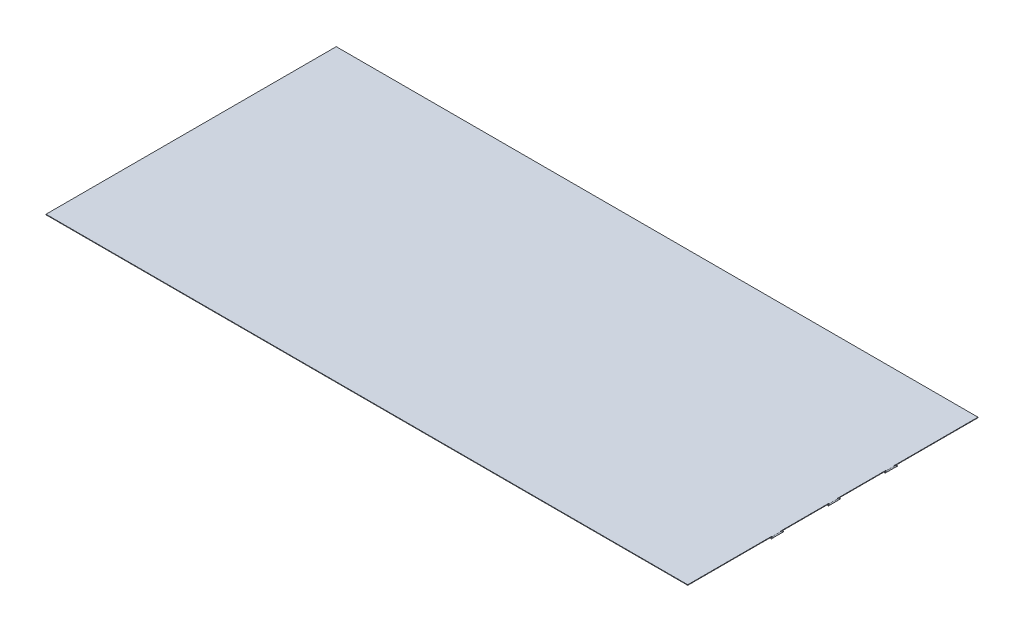
ISO-10303-21;
HEADER;
FILE_DESCRIPTION(('STEP AP214'),'2;1');
FILE_NAME('part.step','',(''),(''),'','','');
FILE_SCHEMA(('AUTOMOTIVE_DESIGN { 1 0 10303 214 1 1 1 1 }'));
ENDSEC;
DATA;
#1=APPLICATION_CONTEXT('core data for automotive mechanical design processes');
#2=APPLICATION_PROTOCOL_DEFINITION('international standard','automotive_design',2000,#1);
#3=PRODUCT_CONTEXT('',#1,'mechanical');
#4=PRODUCT('Part','Part','',(#3));
#5=PRODUCT_RELATED_PRODUCT_CATEGORY('part','',(#4));
#6=PRODUCT_DEFINITION_FORMATION('','',#4);
#7=PRODUCT_DEFINITION_CONTEXT('part definition',#1,'design');
#8=PRODUCT_DEFINITION('design','',#6,#7);
#9=PRODUCT_DEFINITION_SHAPE('','',#8);
#10=(LENGTH_UNIT() NAMED_UNIT(*) SI_UNIT(.MILLI.,.METRE.));
#11=(NAMED_UNIT(*) PLANE_ANGLE_UNIT() SI_UNIT($,.RADIAN.));
#12=(NAMED_UNIT(*) SI_UNIT($,.STERADIAN.) SOLID_ANGLE_UNIT());
#13=UNCERTAINTY_MEASURE_WITH_UNIT(LENGTH_MEASURE(1.E-05),#10,'distance_accuracy_value','');
#14=(GEOMETRIC_REPRESENTATION_CONTEXT(3) GLOBAL_UNCERTAINTY_ASSIGNED_CONTEXT((#13)) GLOBAL_UNIT_ASSIGNED_CONTEXT((#10,
#11,#12)) REPRESENTATION_CONTEXT('',''));
#15=CARTESIAN_POINT('',(0.,0.,0.));
#16=DIRECTION('',(0.,0.,1.));
#17=DIRECTION('',(1.,0.,0.));
#18=AXIS2_PLACEMENT_3D('',#15,#16,#17);
#19=CARTESIAN_POINT('',(3044.,5.,-1376.6));
#20=DIRECTION('',(-1.,0.,0.));
#21=DIRECTION('',(0.,0.,1.));
#22=AXIS2_PLACEMENT_3D('',#19,#20,#21);
#23=PLANE('',#22);
#24=DIRECTION('',(0.,1.,0.));
#25=VECTOR('',#24,1.);
#26=CARTESIAN_POINT('',(3044.,0.,500.));
#27=LINE('',#26,#25);
#28=CARTESIAN_POINT('',(3044.,0.,500.));
#29=VERTEX_POINT('',#28);
#30=CARTESIAN_POINT('',(3044.,5.,500.));
#31=VERTEX_POINT('',#30);
#32=EDGE_CURVE('E282',#29,#31,#27,.T.);
#33=ORIENTED_EDGE('',*,*,#32,.F.);
#34=DIRECTION('',(0.,0.,-1.));
#35=VECTOR('',#34,1.);
#36=CARTESIAN_POINT('',(3044.,0.,-1376.6));
#37=LINE('',#36,#35);
#38=CARTESIAN_POINT('',(3044.,0.,39.9999999999996));
#39=VERTEX_POINT('',#38);
#40=EDGE_CURVE('E346',#29,#39,#37,.T.);
#41=ORIENTED_EDGE('',*,*,#40,.T.);
#42=DIRECTION('',(0.,-1.,0.));
#43=VECTOR('',#42,1.);
#44=CARTESIAN_POINT('',(3044.,0.,40.));
#45=LINE('',#44,#43);
#46=CARTESIAN_POINT('',(3044.,5.,39.9999999999996));
#47=VERTEX_POINT('',#46);
#48=EDGE_CURVE('E306',#47,#39,#45,.T.);
#49=ORIENTED_EDGE('',*,*,#48,.F.);
#50=DIRECTION('',(0.,0.,-1.));
#51=VECTOR('',#50,1.);
#52=CARTESIAN_POINT('',(3044.,5.,-1376.6));
#53=LINE('',#52,#51);
#54=EDGE_CURVE('E330',#31,#47,#53,.T.);
#55=ORIENTED_EDGE('',*,*,#54,.F.);
#56=EDGE_LOOP('',(#33,#41,#49,#55));
#57=FACE_BOUND('',#56,.T.);
#58=ADVANCED_FACE('F43',(#57),#23,.F.);
#59=DIRECTION('',(0.,-1.,0.));
#60=VECTOR('',#59,1.);
#61=CARTESIAN_POINT('',(3044.,0.,580.));
#62=LINE('',#61,#60);
#63=CARTESIAN_POINT('',(3044.,5.,580.));
#64=VERTEX_POINT('',#63);
#65=CARTESIAN_POINT('',(3044.,0.,580.));
#66=VERTEX_POINT('',#65);
#67=EDGE_CURVE('E279',#64,#66,#62,.T.);
#68=ORIENTED_EDGE('',*,*,#67,.F.);
#69=CARTESIAN_POINT('',(3044.,5.,1376.6));
#70=VERTEX_POINT('',#69);
#71=EDGE_CURVE('E169',#70,#64,#53,.T.);
#72=ORIENTED_EDGE('',*,*,#71,.F.);
#73=DIRECTION('',(0.,-1.,0.));
#74=VECTOR('',#73,1.);
#75=CARTESIAN_POINT('',(3044.,5.,1376.6));
#76=LINE('',#75,#74);
#77=CARTESIAN_POINT('',(3044.,0.,1376.6));
#78=VERTEX_POINT('',#77);
#79=EDGE_CURVE('E340',#70,#78,#76,.T.);
#80=ORIENTED_EDGE('',*,*,#79,.T.);
#81=EDGE_CURVE('E341',#78,#66,#37,.T.);
#82=ORIENTED_EDGE('',*,*,#81,.T.);
#83=EDGE_LOOP('',(#68,#72,#80,#82));
#84=FACE_BOUND('',#83,.T.);
#85=ADVANCED_FACE('F383',(#84),#23,.F.);
#86=DIRECTION('',(0.,1.,0.));
#87=VECTOR('',#86,1.);
#88=CARTESIAN_POINT('',(3044.,0.,-580.));
#89=LINE('',#88,#87);
#90=CARTESIAN_POINT('',(3044.,0.,-580.));
#91=VERTEX_POINT('',#90);
#92=CARTESIAN_POINT('',(3044.,5.,-580.));
#93=VERTEX_POINT('',#92);
#94=EDGE_CURVE('E302',#91,#93,#89,.T.);
#95=ORIENTED_EDGE('',*,*,#94,.F.);
#96=CARTESIAN_POINT('',(3044.,0.,-1376.6));
#97=VERTEX_POINT('',#96);
#98=EDGE_CURVE('E326',#91,#97,#37,.T.);
#99=ORIENTED_EDGE('',*,*,#98,.T.);
#100=DIRECTION('',(0.,-1.,0.));
#101=VECTOR('',#100,1.);
#102=CARTESIAN_POINT('',(3044.,5.,-1376.6));
#103=LINE('',#102,#101);
#104=CARTESIAN_POINT('',(3044.,5.,-1376.6));
#105=VERTEX_POINT('',#104);
#106=EDGE_CURVE('E11',#105,#97,#103,.T.);
#107=ORIENTED_EDGE('',*,*,#106,.F.);
#108=EDGE_CURVE('E356',#93,#105,#53,.T.);
#109=ORIENTED_EDGE('',*,*,#108,.F.);
#110=EDGE_LOOP('',(#95,#99,#107,#109));
#111=FACE_BOUND('',#110,.T.);
#112=ADVANCED_FACE('F385',(#111),#23,.F.);
#113=DIRECTION('',(0.,-1.,0.));
#114=VECTOR('',#113,1.);
#115=CARTESIAN_POINT('',(3044.,0.,-500.));
#116=LINE('',#115,#114);
#117=CARTESIAN_POINT('',(3044.,5.,-500.));
#118=VERTEX_POINT('',#117);
#119=CARTESIAN_POINT('',(3044.,0.,-500.));
#120=VERTEX_POINT('',#119);
#121=EDGE_CURVE('E298',#118,#120,#116,.T.);
#122=ORIENTED_EDGE('',*,*,#121,.F.);
#123=CARTESIAN_POINT('',(3044.,5.00000000000028,-40.));
#124=VERTEX_POINT('',#123);
#125=EDGE_CURVE('E331',#124,#118,#53,.T.);
#126=ORIENTED_EDGE('',*,*,#125,.F.);
#127=DIRECTION('',(0.,1.,0.));
#128=VECTOR('',#127,1.);
#129=CARTESIAN_POINT('',(3044.,0.,-40.));
#130=LINE('',#129,#128);
#131=CARTESIAN_POINT('',(3044.,0.,-40.0000000000005));
#132=VERTEX_POINT('',#131);
#133=EDGE_CURVE('E310',#132,#124,#130,.T.);
#134=ORIENTED_EDGE('',*,*,#133,.F.);
#135=EDGE_CURVE('E347',#132,#120,#37,.T.);
#136=ORIENTED_EDGE('',*,*,#135,.T.);
#137=EDGE_LOOP('',(#122,#126,#134,#136));
#138=FACE_BOUND('',#137,.T.);
#139=ADVANCED_FACE('F390',(#138),#23,.F.);
#140=CARTESIAN_POINT('',(-3044.,5.,-1376.6));
#141=DIRECTION('',(0.,0.,1.));
#142=DIRECTION('',(1.,0.,0.));
#143=AXIS2_PLACEMENT_3D('',#140,#141,#142);
#144=PLANE('',#143);
#145=DIRECTION('',(-1.,0.,0.));
#146=VECTOR('',#145,1.);
#147=CARTESIAN_POINT('',(-3044.,0.,-1376.6));
#148=LINE('',#147,#146);
#149=CARTESIAN_POINT('',(-3044.,0.,-1376.6));
#150=VERTEX_POINT('',#149);
#151=EDGE_CURVE('E345',#97,#150,#148,.T.);
#152=ORIENTED_EDGE('',*,*,#151,.T.);
#153=DIRECTION('',(0.,-1.,0.));
#154=VECTOR('',#153,1.);
#155=CARTESIAN_POINT('',(-3044.,5.,-1376.6));
#156=LINE('',#155,#154);
#157=CARTESIAN_POINT('',(-3044.,5.,-1376.6));
#158=VERTEX_POINT('',#157);
#159=EDGE_CURVE('E51',#158,#150,#156,.T.);
#160=ORIENTED_EDGE('',*,*,#159,.F.);
#161=DIRECTION('',(-1.,0.,0.));
#162=VECTOR('',#161,1.);
#163=CARTESIAN_POINT('',(-3044.,5.,-1376.6));
#164=LINE('',#163,#162);
#165=EDGE_CURVE('E329',#105,#158,#164,.T.);
#166=ORIENTED_EDGE('',*,*,#165,.F.);
#167=ORIENTED_EDGE('',*,*,#106,.T.);
#168=EDGE_LOOP('',(#152,#160,#166,#167));
#169=FACE_BOUND('',#168,.T.);
#170=ADVANCED_FACE('F397',(#169),#144,.F.);
#171=CARTESIAN_POINT('',(-3044.,5.,-1376.6));
#172=DIRECTION('',(1.,0.,0.));
#173=DIRECTION('',(0.,0.,-1.));
#174=AXIS2_PLACEMENT_3D('',#171,#172,#173);
#175=PLANE('',#174);
#176=DIRECTION('',(0.,0.,1.));
#177=VECTOR('',#176,1.);
#178=CARTESIAN_POINT('',(-3044.,0.,-1376.6));
#179=LINE('',#178,#177);
#180=CARTESIAN_POINT('',(-3044.,0.,1376.6));
#181=VERTEX_POINT('',#180);
#182=EDGE_CURVE('E350',#150,#181,#179,.T.);
#183=ORIENTED_EDGE('',*,*,#182,.T.);
#184=DIRECTION('',(0.,-1.,0.));
#185=VECTOR('',#184,1.);
#186=CARTESIAN_POINT('',(-3044.,5.,1376.6));
#187=LINE('',#186,#185);
#188=CARTESIAN_POINT('',(-3044.,5.,1376.6));
#189=VERTEX_POINT('',#188);
#190=EDGE_CURVE('E360',#189,#181,#187,.T.);
#191=ORIENTED_EDGE('',*,*,#190,.F.);
#192=DIRECTION('',(0.,0.,1.));
#193=VECTOR('',#192,1.);
#194=CARTESIAN_POINT('',(-3044.,5.,-1376.6));
#195=LINE('',#194,#193);
#196=EDGE_CURVE('E334',#158,#189,#195,.T.);
#197=ORIENTED_EDGE('',*,*,#196,.F.);
#198=ORIENTED_EDGE('',*,*,#159,.T.);
#199=EDGE_LOOP('',(#183,#191,#197,#198));
#200=FACE_BOUND('',#199,.T.);
#201=ADVANCED_FACE('F369',(#200),#175,.F.);
#202=CARTESIAN_POINT('',(-3044.,5.,1376.6));
#203=DIRECTION('',(0.,0.,-1.));
#204=DIRECTION('',(-1.,0.,0.));
#205=AXIS2_PLACEMENT_3D('',#202,#203,#204);
#206=PLANE('',#205);
#207=DIRECTION('',(1.,0.,0.));
#208=VECTOR('',#207,1.);
#209=CARTESIAN_POINT('',(-3044.,0.,1376.6));
#210=LINE('',#209,#208);
#211=EDGE_CURVE('E353',#181,#78,#210,.T.);
#212=ORIENTED_EDGE('',*,*,#211,.T.);
#213=ORIENTED_EDGE('',*,*,#79,.F.);
#214=DIRECTION('',(1.,0.,0.));
#215=VECTOR('',#214,1.);
#216=CARTESIAN_POINT('',(-3044.,5.,1376.6));
#217=LINE('',#216,#215);
#218=EDGE_CURVE('E337',#189,#70,#217,.T.);
#219=ORIENTED_EDGE('',*,*,#218,.F.);
#220=ORIENTED_EDGE('',*,*,#190,.T.);
#221=EDGE_LOOP('',(#212,#213,#219,#220));
#222=FACE_BOUND('',#221,.T.);
#223=ADVANCED_FACE('F380',(#222),#206,.F.);
#224=CARTESIAN_POINT('',(0.,5.,0.));
#225=DIRECTION('',(0.,1.,0.));
#226=DIRECTION('',(0.,0.,1.));
#227=AXIS2_PLACEMENT_3D('',#224,#225,#226);
#228=PLANE('',#227);
#229=DIRECTION('',(0.,0.,1.));
#230=VECTOR('',#229,1.);
#231=CARTESIAN_POINT('',(3049.66987298108,5.,500.));
#232=LINE('',#231,#230);
#233=CARTESIAN_POINT('',(3049.66987298108,5.,500.));
#234=VERTEX_POINT('',#233);
#235=CARTESIAN_POINT('',(3049.66987298108,5.,580.));
#236=VERTEX_POINT('',#235);
#237=EDGE_CURVE('E154',#234,#236,#232,.T.);
#238=ORIENTED_EDGE('',*,*,#237,.F.);
#239=DIRECTION('',(-1.,0.,0.));
#240=VECTOR('',#239,1.);
#241=CARTESIAN_POINT('',(3054.,5.,500.));
#242=LINE('',#241,#240);
#243=EDGE_CURVE('E175',#234,#31,#242,.T.);
#244=ORIENTED_EDGE('',*,*,#243,.T.);
#245=ORIENTED_EDGE('',*,*,#54,.T.);
#246=DIRECTION('',(-1.,0.,0.));
#247=VECTOR('',#246,1.);
#248=CARTESIAN_POINT('',(3054.,5.00000000000025,40.));
#249=LINE('',#248,#247);
#250=CARTESIAN_POINT('',(3049.66987298108,5.0000000000001,40.));
#251=VERTEX_POINT('',#250);
#252=EDGE_CURVE('E314',#251,#47,#249,.T.);
#253=ORIENTED_EDGE('',*,*,#252,.F.);
#254=DIRECTION('',(0.,0.,1.));
#255=VECTOR('',#254,1.);
#256=CARTESIAN_POINT('',(3049.66987298108,5.,-40.));
#257=LINE('',#256,#255);
#258=CARTESIAN_POINT('',(3049.66987298108,5.00000000000028,-40.));
#259=VERTEX_POINT('',#258);
#260=EDGE_CURVE('E269',#259,#251,#257,.T.);
#261=ORIENTED_EDGE('',*,*,#260,.F.);
#262=DIRECTION('',(-1.,0.,0.));
#263=VECTOR('',#262,1.);
#264=CARTESIAN_POINT('',(3054.,5.00000000000028,-40.));
#265=LINE('',#264,#263);
#266=EDGE_CURVE('E317',#259,#124,#265,.T.);
#267=ORIENTED_EDGE('',*,*,#266,.T.);
#268=ORIENTED_EDGE('',*,*,#125,.T.);
#269=DIRECTION('',(-1.,0.,0.));
#270=VECTOR('',#269,1.);
#271=CARTESIAN_POINT('',(3054.,5.,-500.));
#272=LINE('',#271,#270);
#273=CARTESIAN_POINT('',(3049.66987298108,4.99999999999981,-500.));
#274=VERTEX_POINT('',#273);
#275=EDGE_CURVE('E292',#274,#118,#272,.T.);
#276=ORIENTED_EDGE('',*,*,#275,.F.);
#277=DIRECTION('',(0.,0.,1.));
#278=VECTOR('',#277,1.);
#279=CARTESIAN_POINT('',(3049.66987298108,5.,-580.));
#280=LINE('',#279,#278);
#281=CARTESIAN_POINT('',(3049.66987298108,5.,-580.));
#282=VERTEX_POINT('',#281);
#283=EDGE_CURVE('E232',#282,#274,#280,.T.);
#284=ORIENTED_EDGE('',*,*,#283,.F.);
#285=DIRECTION('',(-1.,0.,0.));
#286=VECTOR('',#285,1.);
#287=CARTESIAN_POINT('',(3054.,5.,-580.));
#288=LINE('',#287,#286);
#289=EDGE_CURVE('E289',#282,#93,#288,.T.);
#290=ORIENTED_EDGE('',*,*,#289,.T.);
#291=ORIENTED_EDGE('',*,*,#108,.T.);
#292=ORIENTED_EDGE('',*,*,#165,.T.);
#293=ORIENTED_EDGE('',*,*,#196,.T.);
#294=ORIENTED_EDGE('',*,*,#218,.T.);
#295=ORIENTED_EDGE('',*,*,#71,.T.);
#296=DIRECTION('',(-1.,0.,0.));
#297=VECTOR('',#296,1.);
#298=CARTESIAN_POINT('',(3054.,5.,580.));
#299=LINE('',#298,#297);
#300=EDGE_CURVE('E166',#236,#64,#299,.T.);
#301=ORIENTED_EDGE('',*,*,#300,.F.);
#302=EDGE_LOOP('',(#238,#244,#245,#253,#261,#267,#268,#276,#284,#290,#291,#292,#293,#294,#295,#301));
#303=FACE_BOUND('',#302,.T.);
#304=ADVANCED_FACE('F167',(#303),#228,.T.);
#305=CARTESIAN_POINT('',(0.,0.,0.));
#306=DIRECTION('',(0.,1.,0.));
#307=DIRECTION('',(0.,0.,1.));
#308=AXIS2_PLACEMENT_3D('',#305,#306,#307);
#309=PLANE('',#308);
#310=DIRECTION('',(-1.,0.,0.));
#311=VECTOR('',#310,1.);
#312=CARTESIAN_POINT('',(3054.,0.,500.));
#313=LINE('',#312,#311);
#314=CARTESIAN_POINT('',(3049.66987298108,0.,500.));
#315=VERTEX_POINT('',#314);
#316=EDGE_CURVE('E276',#315,#29,#313,.T.);
#317=ORIENTED_EDGE('',*,*,#316,.F.);
#318=DIRECTION('',(0.,0.,1.));
#319=VECTOR('',#318,1.);
#320=CARTESIAN_POINT('',(3049.66987298108,0.,500.));
#321=LINE('',#320,#319);
#322=CARTESIAN_POINT('',(3049.66987298108,0.,580.));
#323=VERTEX_POINT('',#322);
#324=EDGE_CURVE('E65',#315,#323,#321,.T.);
#325=ORIENTED_EDGE('',*,*,#324,.T.);
#326=DIRECTION('',(-1.,0.,0.));
#327=VECTOR('',#326,1.);
#328=CARTESIAN_POINT('',(3054.,0.,580.));
#329=LINE('',#328,#327);
#330=EDGE_CURVE('E174',#323,#66,#329,.T.);
#331=ORIENTED_EDGE('',*,*,#330,.T.);
#332=ORIENTED_EDGE('',*,*,#81,.F.);
#333=ORIENTED_EDGE('',*,*,#211,.F.);
#334=ORIENTED_EDGE('',*,*,#182,.F.);
#335=ORIENTED_EDGE('',*,*,#151,.F.);
#336=ORIENTED_EDGE('',*,*,#98,.F.);
#337=DIRECTION('',(-1.,0.,0.));
#338=VECTOR('',#337,1.);
#339=CARTESIAN_POINT('',(3054.,0.,-580.));
#340=LINE('',#339,#338);
#341=CARTESIAN_POINT('',(3049.66987298108,-2.15973072759112E-13,-580.));
#342=VERTEX_POINT('',#341);
#343=EDGE_CURVE('E286',#342,#91,#340,.T.);
#344=ORIENTED_EDGE('',*,*,#343,.F.);
#345=DIRECTION('',(0.,0.,1.));
#346=VECTOR('',#345,1.);
#347=CARTESIAN_POINT('',(3049.66987298108,0.,-580.));
#348=LINE('',#347,#346);
#349=CARTESIAN_POINT('',(3049.66987298108,0.,-500.));
#350=VERTEX_POINT('',#349);
#351=EDGE_CURVE('E229',#342,#350,#348,.T.);
#352=ORIENTED_EDGE('',*,*,#351,.T.);
#353=DIRECTION('',(-1.,0.,0.));
#354=VECTOR('',#353,1.);
#355=CARTESIAN_POINT('',(3054.,0.,-500.));
#356=LINE('',#355,#354);
#357=EDGE_CURVE('E295',#350,#120,#356,.T.);
#358=ORIENTED_EDGE('',*,*,#357,.T.);
#359=ORIENTED_EDGE('',*,*,#135,.F.);
#360=DIRECTION('',(-1.,0.,0.));
#361=VECTOR('',#360,1.);
#362=CARTESIAN_POINT('',(3054.,0.,-40.));
#363=LINE('',#362,#361);
#364=CARTESIAN_POINT('',(3049.66987298108,0.,-40.));
#365=VERTEX_POINT('',#364);
#366=EDGE_CURVE('E320',#365,#132,#363,.T.);
#367=ORIENTED_EDGE('',*,*,#366,.F.);
#368=DIRECTION('',(0.,0.,1.));
#369=VECTOR('',#368,1.);
#370=CARTESIAN_POINT('',(3049.66987298108,0.,-40.));
#371=LINE('',#370,#369);
#372=CARTESIAN_POINT('',(3049.66987298108,0.,40.));
#373=VERTEX_POINT('',#372);
#374=EDGE_CURVE('E263',#365,#373,#371,.T.);
#375=ORIENTED_EDGE('',*,*,#374,.T.);
#376=DIRECTION('',(-1.,0.,0.));
#377=VECTOR('',#376,1.);
#378=CARTESIAN_POINT('',(3054.,0.,40.));
#379=LINE('',#378,#377);
#380=EDGE_CURVE('E323',#373,#39,#379,.T.);
#381=ORIENTED_EDGE('',*,*,#380,.T.);
#382=ORIENTED_EDGE('',*,*,#40,.F.);
#383=EDGE_LOOP('',(#317,#325,#331,#332,#333,#334,#335,#336,#344,#352,#358,#359,#367,#375,#381,#382));
#384=FACE_BOUND('',#383,.T.);
#385=ADVANCED_FACE('F375',(#384),#309,.F.);
#386=CARTESIAN_POINT('',(3054.,0.,40.));
#387=DIRECTION('',(0.,0.,-1.));
#388=DIRECTION('',(-1.,0.,0.));
#389=AXIS2_PLACEMENT_3D('',#386,#387,#388);
#390=PLANE('',#389);
#391=CARTESIAN_POINT('',(3054.,2.5,40.));
#392=DIRECTION('',(0.,0.,1.));
#393=DIRECTION('',(1.,0.,0.));
#394=AXIS2_PLACEMENT_3D('',#391,#392,#393);
#395=CIRCLE('',#394,4.99999999999982);
#396=EDGE_CURVE('E255',#251,#373,#395,.T.);
#397=ORIENTED_EDGE('',*,*,#396,.F.);
#398=ORIENTED_EDGE('',*,*,#252,.T.);
#399=ORIENTED_EDGE('',*,*,#48,.T.);
#400=ORIENTED_EDGE('',*,*,#380,.F.);
#401=EDGE_LOOP('',(#397,#398,#399,#400));
#402=FACE_BOUND('',#401,.T.);
#403=ADVANCED_FACE('F434',(#402),#390,.F.);
#404=CARTESIAN_POINT('',(3054.,0.,-40.));
#405=DIRECTION('',(0.,0.,1.));
#406=DIRECTION('',(1.,0.,0.));
#407=AXIS2_PLACEMENT_3D('',#404,#405,#406);
#408=PLANE('',#407);
#409=ORIENTED_EDGE('',*,*,#266,.F.);
#410=CARTESIAN_POINT('',(3054.,2.5,-40.));
#411=DIRECTION('',(0.,0.,1.));
#412=DIRECTION('',(1.,0.,0.));
#413=AXIS2_PLACEMENT_3D('',#410,#411,#412);
#414=CIRCLE('',#413,4.99999999999982);
#415=EDGE_CURVE('E247',#259,#365,#414,.T.);
#416=ORIENTED_EDGE('',*,*,#415,.T.);
#417=ORIENTED_EDGE('',*,*,#366,.T.);
#418=ORIENTED_EDGE('',*,*,#133,.T.);
#419=EDGE_LOOP('',(#409,#416,#417,#418));
#420=FACE_BOUND('',#419,.T.);
#421=ADVANCED_FACE('F453',(#420),#408,.F.);
#422=CARTESIAN_POINT('',(3054.,0.,-580.));
#423=DIRECTION('',(0.,0.,1.));
#424=DIRECTION('',(1.,0.,0.));
#425=AXIS2_PLACEMENT_3D('',#422,#423,#424);
#426=PLANE('',#425);
#427=ORIENTED_EDGE('',*,*,#289,.F.);
#428=CARTESIAN_POINT('',(3054.,2.49999999999968,-580.));
#429=DIRECTION('',(0.,0.,1.));
#430=DIRECTION('',(1.,0.,0.));
#431=AXIS2_PLACEMENT_3D('',#428,#429,#430);
#432=CIRCLE('',#431,4.99999999999982);
#433=EDGE_CURVE('E226',#282,#342,#432,.T.);
#434=ORIENTED_EDGE('',*,*,#433,.T.);
#435=ORIENTED_EDGE('',*,*,#343,.T.);
#436=ORIENTED_EDGE('',*,*,#94,.T.);
#437=EDGE_LOOP('',(#427,#434,#435,#436));
#438=FACE_BOUND('',#437,.T.);
#439=ADVANCED_FACE('F447',(#438),#426,.F.);
#440=CARTESIAN_POINT('',(3054.,0.,-500.));
#441=DIRECTION('',(0.,0.,-1.));
#442=DIRECTION('',(-1.,0.,0.));
#443=AXIS2_PLACEMENT_3D('',#440,#441,#442);
#444=PLANE('',#443);
#445=CARTESIAN_POINT('',(3054.,2.49999999999968,-500.));
#446=DIRECTION('',(0.,0.,1.));
#447=DIRECTION('',(1.,0.,0.));
#448=AXIS2_PLACEMENT_3D('',#445,#446,#447);
#449=CIRCLE('',#448,4.99999999999982);
#450=EDGE_CURVE('E163',#274,#350,#449,.T.);
#451=ORIENTED_EDGE('',*,*,#450,.F.);
#452=ORIENTED_EDGE('',*,*,#275,.T.);
#453=ORIENTED_EDGE('',*,*,#121,.T.);
#454=ORIENTED_EDGE('',*,*,#357,.F.);
#455=EDGE_LOOP('',(#451,#452,#453,#454));
#456=FACE_BOUND('',#455,.T.);
#457=ADVANCED_FACE('F439',(#456),#444,.F.);
#458=CARTESIAN_POINT('',(3054.,0.,500.));
#459=DIRECTION('',(0.,0.,1.));
#460=DIRECTION('',(1.,0.,0.));
#461=AXIS2_PLACEMENT_3D('',#458,#459,#460);
#462=PLANE('',#461);
#463=ORIENTED_EDGE('',*,*,#243,.F.);
#464=CARTESIAN_POINT('',(3054.,2.5,500.));
#465=DIRECTION('',(0.,0.,1.));
#466=DIRECTION('',(1.,0.,0.));
#467=AXIS2_PLACEMENT_3D('',#464,#465,#466);
#468=CIRCLE('',#467,4.99999999999982);
#469=EDGE_CURVE('E58',#234,#315,#468,.T.);
#470=ORIENTED_EDGE('',*,*,#469,.T.);
#471=ORIENTED_EDGE('',*,*,#316,.T.);
#472=ORIENTED_EDGE('',*,*,#32,.T.);
#473=EDGE_LOOP('',(#463,#470,#471,#472));
#474=FACE_BOUND('',#473,.T.);
#475=ADVANCED_FACE('F437',(#474),#462,.F.);
#476=CARTESIAN_POINT('',(3054.,0.,580.));
#477=DIRECTION('',(0.,0.,-1.));
#478=DIRECTION('',(-1.,0.,0.));
#479=AXIS2_PLACEMENT_3D('',#476,#477,#478);
#480=PLANE('',#479);
#481=CARTESIAN_POINT('',(3054.,2.5,580.));
#482=DIRECTION('',(0.,0.,1.));
#483=DIRECTION('',(1.,0.,0.));
#484=AXIS2_PLACEMENT_3D('',#481,#482,#483);
#485=CIRCLE('',#484,4.99999999999982);
#486=EDGE_CURVE('E159',#236,#323,#485,.T.);
#487=ORIENTED_EDGE('',*,*,#486,.F.);
#488=ORIENTED_EDGE('',*,*,#300,.T.);
#489=ORIENTED_EDGE('',*,*,#67,.T.);
#490=ORIENTED_EDGE('',*,*,#330,.F.);
#491=EDGE_LOOP('',(#487,#488,#489,#490));
#492=FACE_BOUND('',#491,.T.);
#493=ADVANCED_FACE('F177',(#492),#480,.F.);
#494=CARTESIAN_POINT('',(3054.,2.5,-40.));
#495=DIRECTION('',(0.,0.,1.));
#496=DIRECTION('',(1.,0.,0.));
#497=AXIS2_PLACEMENT_3D('',#494,#495,#496);
#498=CYLINDRICAL_SURFACE('',#497,4.99999999999982);
#499=ORIENTED_EDGE('',*,*,#415,.F.);
#500=ORIENTED_EDGE('',*,*,#260,.T.);
#501=ORIENTED_EDGE('',*,*,#396,.T.);
#502=ORIENTED_EDGE('',*,*,#374,.F.);
#503=EDGE_LOOP('',(#499,#500,#501,#502));
#504=FACE_BOUND('',#503,.T.);
#505=CARTESIAN_POINT('',(3054.,2.5,-50.));
#506=DIRECTION('',(0.,0.,1.));
#507=DIRECTION('',(1.,0.,0.));
#508=AXIS2_PLACEMENT_3D('',#505,#506,#507);
#509=CIRCLE('',#508,4.99999999999982);
#510=CARTESIAN_POINT('',(3059.,2.5,-50.));
#511=VERTEX_POINT('',#510);
#512=EDGE_CURVE('E240',#511,#511,#509,.T.);
#513=ORIENTED_EDGE('',*,*,#512,.T.);
#514=EDGE_LOOP('',(#513));
#515=FACE_BOUND('',#514,.T.);
#516=CARTESIAN_POINT('',(3054.,2.5,50.));
#517=DIRECTION('',(0.,0.,1.));
#518=DIRECTION('',(1.,0.,0.));
#519=AXIS2_PLACEMENT_3D('',#516,#517,#518);
#520=CIRCLE('',#519,4.99999999999982);
#521=CARTESIAN_POINT('',(3059.,2.5,50.));
#522=VERTEX_POINT('',#521);
#523=EDGE_CURVE('E259',#522,#522,#520,.T.);
#524=ORIENTED_EDGE('',*,*,#523,.F.);
#525=EDGE_LOOP('',(#524));
#526=FACE_BOUND('',#525,.T.);
#527=ADVANCED_FACE('F445',(#504,#515,#526),#498,.T.);
#528=CARTESIAN_POINT('',(3054.,2.5,55.));
#529=DIRECTION('',(0.,0.,-1.));
#530=DIRECTION('',(-1.,0.,0.));
#531=AXIS2_PLACEMENT_3D('',#528,#529,#530);
#532=CYLINDRICAL_SURFACE('',#531,5.99999999999986);
#533=CARTESIAN_POINT('',(3054.,2.5,55.));
#534=DIRECTION('',(0.,0.,1.));
#535=DIRECTION('',(1.,0.,0.));
#536=AXIS2_PLACEMENT_3D('',#533,#534,#535);
#537=CIRCLE('',#536,5.99999999999986);
#538=CARTESIAN_POINT('',(3060.,2.5,55.));
#539=VERTEX_POINT('',#538);
#540=EDGE_CURVE('E251',#539,#539,#537,.T.);
#541=ORIENTED_EDGE('',*,*,#540,.F.);
#542=EDGE_LOOP('',(#541));
#543=FACE_BOUND('',#542,.T.);
#544=CARTESIAN_POINT('',(3054.,2.5,50.));
#545=DIRECTION('',(0.,0.,1.));
#546=DIRECTION('',(1.,0.,0.));
#547=AXIS2_PLACEMENT_3D('',#544,#545,#546);
#548=CIRCLE('',#547,5.99999999999986);
#549=CARTESIAN_POINT('',(3060.,2.5,50.));
#550=VERTEX_POINT('',#549);
#551=EDGE_CURVE('E250',#550,#550,#548,.T.);
#552=ORIENTED_EDGE('',*,*,#551,.T.);
#553=EDGE_LOOP('',(#552));
#554=FACE_BOUND('',#553,.T.);
#555=ADVANCED_FACE('F729',(#543,#554),#532,.T.);
#556=CARTESIAN_POINT('',(3054.,2.5,55.));
#557=DIRECTION('',(0.,0.,1.));
#558=DIRECTION('',(1.,0.,0.));
#559=AXIS2_PLACEMENT_3D('',#556,#557,#558);
#560=PLANE('',#559);
#561=ORIENTED_EDGE('',*,*,#540,.T.);
#562=EDGE_LOOP('',(#561));
#563=FACE_BOUND('',#562,.T.);
#564=ADVANCED_FACE('F720',(#563),#560,.T.);
#565=CARTESIAN_POINT('',(3054.,2.5,50.));
#566=DIRECTION('',(0.,0.,1.));
#567=DIRECTION('',(1.,0.,0.));
#568=AXIS2_PLACEMENT_3D('',#565,#566,#567);
#569=PLANE('',#568);
#570=ORIENTED_EDGE('',*,*,#523,.T.);
#571=EDGE_LOOP('',(#570));
#572=FACE_BOUND('',#571,.T.);
#573=ORIENTED_EDGE('',*,*,#551,.F.);
#574=EDGE_LOOP('',(#573));
#575=FACE_BOUND('',#574,.T.);
#576=ADVANCED_FACE('F710',(#572,#575),#569,.F.);
#577=CARTESIAN_POINT('',(3054.,2.5,-55.));
#578=DIRECTION('',(0.,0.,1.));
#579=DIRECTION('',(1.,0.,0.));
#580=AXIS2_PLACEMENT_3D('',#577,#578,#579);
#581=CYLINDRICAL_SURFACE('',#580,5.99999999999986);
#582=CARTESIAN_POINT('',(3054.,2.5,-55.));
#583=DIRECTION('',(0.,0.,1.));
#584=DIRECTION('',(1.,0.,0.));
#585=AXIS2_PLACEMENT_3D('',#582,#583,#584);
#586=CIRCLE('',#585,5.99999999999986);
#587=CARTESIAN_POINT('',(3060.,2.5,-55.));
#588=VERTEX_POINT('',#587);
#589=EDGE_CURVE('E236',#588,#588,#586,.T.);
#590=ORIENTED_EDGE('',*,*,#589,.T.);
#591=EDGE_LOOP('',(#590));
#592=FACE_BOUND('',#591,.T.);
#593=CARTESIAN_POINT('',(3054.,2.5,-50.));
#594=DIRECTION('',(0.,0.,1.));
#595=DIRECTION('',(1.,0.,0.));
#596=AXIS2_PLACEMENT_3D('',#593,#594,#595);
#597=CIRCLE('',#596,5.99999999999986);
#598=CARTESIAN_POINT('',(3060.,2.5,-50.));
#599=VERTEX_POINT('',#598);
#600=EDGE_CURVE('E235',#599,#599,#597,.T.);
#601=ORIENTED_EDGE('',*,*,#600,.F.);
#602=EDGE_LOOP('',(#601));
#603=FACE_BOUND('',#602,.T.);
#604=ADVANCED_FACE('F700',(#592,#603),#581,.T.);
#605=CARTESIAN_POINT('',(3054.,2.5,-55.));
#606=DIRECTION('',(0.,0.,-1.));
#607=DIRECTION('',(1.,0.,0.));
#608=AXIS2_PLACEMENT_3D('',#605,#606,#607);
#609=PLANE('',#608);
#610=ORIENTED_EDGE('',*,*,#589,.F.);
#611=EDGE_LOOP('',(#610));
#612=FACE_BOUND('',#611,.T.);
#613=ADVANCED_FACE('F691',(#612),#609,.T.);
#614=CARTESIAN_POINT('',(3054.,2.5,-50.));
#615=DIRECTION('',(0.,0.,-1.));
#616=DIRECTION('',(1.,0.,0.));
#617=AXIS2_PLACEMENT_3D('',#614,#615,#616);
#618=PLANE('',#617);
#619=ORIENTED_EDGE('',*,*,#512,.F.);
#620=EDGE_LOOP('',(#619));
#621=FACE_BOUND('',#620,.T.);
#622=ORIENTED_EDGE('',*,*,#600,.T.);
#623=EDGE_LOOP('',(#622));
#624=FACE_BOUND('',#623,.T.);
#625=ADVANCED_FACE('F681',(#621,#624),#618,.F.);
#626=CARTESIAN_POINT('',(3054.,2.49999999999968,-580.));
#627=DIRECTION('',(0.,0.,1.));
#628=DIRECTION('',(1.,0.,0.));
#629=AXIS2_PLACEMENT_3D('',#626,#627,#628);
#630=CYLINDRICAL_SURFACE('',#629,4.99999999999982);
#631=ORIENTED_EDGE('',*,*,#433,.F.);
#632=ORIENTED_EDGE('',*,*,#283,.T.);
#633=ORIENTED_EDGE('',*,*,#450,.T.);
#634=ORIENTED_EDGE('',*,*,#351,.F.);
#635=EDGE_LOOP('',(#631,#632,#633,#634));
#636=FACE_BOUND('',#635,.T.);
#637=CARTESIAN_POINT('',(3054.,2.49999999999968,-590.));
#638=DIRECTION('',(0.,0.,1.));
#639=DIRECTION('',(1.,0.,0.));
#640=AXIS2_PLACEMENT_3D('',#637,#638,#639);
#641=CIRCLE('',#640,4.99999999999982);
#642=CARTESIAN_POINT('',(3059.,2.49999999999968,-590.));
#643=VERTEX_POINT('',#642);
#644=EDGE_CURVE('E219',#643,#643,#641,.T.);
#645=ORIENTED_EDGE('',*,*,#644,.T.);
#646=EDGE_LOOP('',(#645));
#647=FACE_BOUND('',#646,.T.);
#648=CARTESIAN_POINT('',(3054.,2.49999999999968,-490.));
#649=DIRECTION('',(0.,0.,1.));
#650=DIRECTION('',(1.,0.,0.));
#651=AXIS2_PLACEMENT_3D('',#648,#649,#650);
#652=CIRCLE('',#651,4.99999999999982);
#653=CARTESIAN_POINT('',(3059.,2.49999999999968,-490.));
#654=VERTEX_POINT('',#653);
#655=EDGE_CURVE('E207',#654,#654,#652,.T.);
#656=ORIENTED_EDGE('',*,*,#655,.F.);
#657=EDGE_LOOP('',(#656));
#658=FACE_BOUND('',#657,.T.);
#659=ADVANCED_FACE('F518',(#636,#647,#658),#630,.T.);
#660=CARTESIAN_POINT('',(3054.,2.49999999999968,-595.));
#661=DIRECTION('',(0.,0.,1.));
#662=DIRECTION('',(1.,0.,0.));
#663=AXIS2_PLACEMENT_3D('',#660,#661,#662);
#664=CYLINDRICAL_SURFACE('',#663,5.99999999999986);
#665=CARTESIAN_POINT('',(3054.,2.49999999999968,-595.));
#666=DIRECTION('',(0.,0.,1.));
#667=DIRECTION('',(1.,0.,0.));
#668=AXIS2_PLACEMENT_3D('',#665,#666,#667);
#669=CIRCLE('',#668,5.99999999999986);
#670=CARTESIAN_POINT('',(3060.,2.49999999999968,-595.));
#671=VERTEX_POINT('',#670);
#672=EDGE_CURVE('E215',#671,#671,#669,.T.);
#673=ORIENTED_EDGE('',*,*,#672,.T.);
#674=EDGE_LOOP('',(#673));
#675=FACE_BOUND('',#674,.T.);
#676=CARTESIAN_POINT('',(3054.,2.49999999999968,-590.));
#677=DIRECTION('',(0.,0.,1.));
#678=DIRECTION('',(1.,0.,0.));
#679=AXIS2_PLACEMENT_3D('',#676,#677,#678);
#680=CIRCLE('',#679,5.99999999999986);
#681=CARTESIAN_POINT('',(3060.,2.49999999999968,-590.));
#682=VERTEX_POINT('',#681);
#683=EDGE_CURVE('E211',#682,#682,#680,.T.);
#684=ORIENTED_EDGE('',*,*,#683,.F.);
#685=EDGE_LOOP('',(#684));
#686=FACE_BOUND('',#685,.T.);
#687=ADVANCED_FACE('F512',(#675,#686),#664,.T.);
#688=CARTESIAN_POINT('',(3054.,2.49999999999968,-595.));
#689=DIRECTION('',(0.,0.,-1.));
#690=DIRECTION('',(1.,0.,0.));
#691=AXIS2_PLACEMENT_3D('',#688,#689,#690);
#692=PLANE('',#691);
#693=ORIENTED_EDGE('',*,*,#672,.F.);
#694=EDGE_LOOP('',(#693));
#695=FACE_BOUND('',#694,.T.);
#696=ADVANCED_FACE('F517',(#695),#692,.T.);
#697=CARTESIAN_POINT('',(3054.,2.49999999999968,-590.));
#698=DIRECTION('',(0.,0.,-1.));
#699=DIRECTION('',(1.,0.,0.));
#700=AXIS2_PLACEMENT_3D('',#697,#698,#699);
#701=PLANE('',#700);
#702=ORIENTED_EDGE('',*,*,#644,.F.);
#703=EDGE_LOOP('',(#702));
#704=FACE_BOUND('',#703,.T.);
#705=ORIENTED_EDGE('',*,*,#683,.T.);
#706=EDGE_LOOP('',(#705));
#707=FACE_BOUND('',#706,.T.);
#708=ADVANCED_FACE('F530',(#704,#707),#701,.F.);
#709=CARTESIAN_POINT('',(3054.,2.5,500.));
#710=DIRECTION('',(0.,0.,1.));
#711=DIRECTION('',(1.,0.,0.));
#712=AXIS2_PLACEMENT_3D('',#709,#710,#711);
#713=CYLINDRICAL_SURFACE('',#712,4.99999999999982);
#714=ORIENTED_EDGE('',*,*,#469,.F.);
#715=ORIENTED_EDGE('',*,*,#237,.T.);
#716=ORIENTED_EDGE('',*,*,#486,.T.);
#717=ORIENTED_EDGE('',*,*,#324,.F.);
#718=EDGE_LOOP('',(#714,#715,#716,#717));
#719=FACE_BOUND('',#718,.T.);
#720=CARTESIAN_POINT('',(3054.,2.5,490.));
#721=DIRECTION('',(0.,0.,1.));
#722=DIRECTION('',(1.,0.,0.));
#723=AXIS2_PLACEMENT_3D('',#720,#721,#722);
#724=CIRCLE('',#723,4.99999999999982);
#725=CARTESIAN_POINT('',(3059.,2.5,490.));
#726=VERTEX_POINT('',#725);
#727=EDGE_CURVE('E196',#726,#726,#724,.T.);
#728=ORIENTED_EDGE('',*,*,#727,.T.);
#729=EDGE_LOOP('',(#728));
#730=FACE_BOUND('',#729,.T.);
#731=CARTESIAN_POINT('',(3054.,2.5,590.));
#732=DIRECTION('',(0.,0.,1.));
#733=DIRECTION('',(1.,0.,0.));
#734=AXIS2_PLACEMENT_3D('',#731,#732,#733);
#735=CIRCLE('',#734,4.99999999999982);
#736=CARTESIAN_POINT('',(3059.,2.5,590.));
#737=VERTEX_POINT('',#736);
#738=EDGE_CURVE('E179',#737,#737,#735,.T.);
#739=ORIENTED_EDGE('',*,*,#738,.F.);
#740=EDGE_LOOP('',(#739));
#741=FACE_BOUND('',#740,.T.);
#742=ADVANCED_FACE('F156',(#719,#730,#741),#713,.T.);
#743=CARTESIAN_POINT('',(3054.,2.5,485.));
#744=DIRECTION('',(0.,0.,1.));
#745=DIRECTION('',(1.,0.,0.));
#746=AXIS2_PLACEMENT_3D('',#743,#744,#745);
#747=CYLINDRICAL_SURFACE('',#746,5.99999999999986);
#748=CARTESIAN_POINT('',(3054.,2.5,485.));
#749=DIRECTION('',(0.,0.,1.));
#750=DIRECTION('',(1.,0.,0.));
#751=AXIS2_PLACEMENT_3D('',#748,#749,#750);
#752=CIRCLE('',#751,5.99999999999986);
#753=CARTESIAN_POINT('',(3060.,2.5,485.));
#754=VERTEX_POINT('',#753);
#755=EDGE_CURVE('E192',#754,#754,#752,.T.);
#756=ORIENTED_EDGE('',*,*,#755,.T.);
#757=EDGE_LOOP('',(#756));
#758=FACE_BOUND('',#757,.T.);
#759=CARTESIAN_POINT('',(3054.,2.5,490.));
#760=DIRECTION('',(0.,0.,1.));
#761=DIRECTION('',(1.,0.,0.));
#762=AXIS2_PLACEMENT_3D('',#759,#760,#761);
#763=CIRCLE('',#762,5.99999999999986);
#764=CARTESIAN_POINT('',(3060.,2.5,490.));
#765=VERTEX_POINT('',#764);
#766=EDGE_CURVE('E185',#765,#765,#763,.T.);
#767=ORIENTED_EDGE('',*,*,#766,.F.);
#768=EDGE_LOOP('',(#767));
#769=FACE_BOUND('',#768,.T.);
#770=ADVANCED_FACE('F551',(#758,#769),#747,.T.);
#771=CARTESIAN_POINT('',(3054.,2.5,485.));
#772=DIRECTION('',(0.,0.,-1.));
#773=DIRECTION('',(1.,0.,0.));
#774=AXIS2_PLACEMENT_3D('',#771,#772,#773);
#775=PLANE('',#774);
#776=ORIENTED_EDGE('',*,*,#755,.F.);
#777=EDGE_LOOP('',(#776));
#778=FACE_BOUND('',#777,.T.);
#779=ADVANCED_FACE('F560',(#778),#775,.T.);
#780=CARTESIAN_POINT('',(3054.,2.5,490.));
#781=DIRECTION('',(0.,0.,-1.));
#782=DIRECTION('',(1.,0.,0.));
#783=AXIS2_PLACEMENT_3D('',#780,#781,#782);
#784=PLANE('',#783);
#785=ORIENTED_EDGE('',*,*,#727,.F.);
#786=EDGE_LOOP('',(#785));
#787=FACE_BOUND('',#786,.T.);
#788=ORIENTED_EDGE('',*,*,#766,.T.);
#789=EDGE_LOOP('',(#788));
#790=FACE_BOUND('',#789,.T.);
#791=ADVANCED_FACE('F569',(#787,#790),#784,.F.);
#792=CARTESIAN_POINT('',(3054.,2.49999999999885,595.));
#793=DIRECTION('',(0.,0.,-1.));
#794=DIRECTION('',(-1.,0.,0.));
#795=AXIS2_PLACEMENT_3D('',#792,#793,#794);
#796=CYLINDRICAL_SURFACE('',#795,5.99999999999986);
#797=CARTESIAN_POINT('',(3054.,2.49999999999885,595.));
#798=DIRECTION('',(0.,0.,1.));
#799=DIRECTION('',(1.,0.,0.));
#800=AXIS2_PLACEMENT_3D('',#797,#798,#799);
#801=CIRCLE('',#800,5.99999999999986);
#802=CARTESIAN_POINT('',(3060.,2.49999999999885,595.));
#803=VERTEX_POINT('',#802);
#804=EDGE_CURVE('E180',#803,#803,#801,.T.);
#805=ORIENTED_EDGE('',*,*,#804,.F.);
#806=EDGE_LOOP('',(#805));
#807=FACE_BOUND('',#806,.T.);
#808=CARTESIAN_POINT('',(3054.,2.49999999999885,590.));
#809=DIRECTION('',(0.,0.,1.));
#810=DIRECTION('',(1.,0.,0.));
#811=AXIS2_PLACEMENT_3D('',#808,#809,#810);
#812=CIRCLE('',#811,5.99999999999986);
#813=CARTESIAN_POINT('',(3060.,2.49999999999885,590.));
#814=VERTEX_POINT('',#813);
#815=EDGE_CURVE('E188',#814,#814,#812,.T.);
#816=ORIENTED_EDGE('',*,*,#815,.T.);
#817=EDGE_LOOP('',(#816));
#818=FACE_BOUND('',#817,.T.);
#819=ADVANCED_FACE('F577',(#807,#818),#796,.T.);
#820=CARTESIAN_POINT('',(3054.,2.49999999999885,595.));
#821=DIRECTION('',(0.,0.,1.));
#822=DIRECTION('',(1.,0.,0.));
#823=AXIS2_PLACEMENT_3D('',#820,#821,#822);
#824=PLANE('',#823);
#825=ORIENTED_EDGE('',*,*,#804,.T.);
#826=EDGE_LOOP('',(#825));
#827=FACE_BOUND('',#826,.T.);
#828=ADVANCED_FACE('F585',(#827),#824,.T.);
#829=CARTESIAN_POINT('',(3054.,2.49999999999885,590.));
#830=DIRECTION('',(0.,0.,1.));
#831=DIRECTION('',(1.,0.,0.));
#832=AXIS2_PLACEMENT_3D('',#829,#830,#831);
#833=PLANE('',#832);
#834=ORIENTED_EDGE('',*,*,#738,.T.);
#835=EDGE_LOOP('',(#834));
#836=FACE_BOUND('',#835,.T.);
#837=ORIENTED_EDGE('',*,*,#815,.F.);
#838=EDGE_LOOP('',(#837));
#839=FACE_BOUND('',#838,.T.);
#840=ADVANCED_FACE('F593',(#836,#839),#833,.F.);
#841=CARTESIAN_POINT('',(3054.,2.5,-485.));
#842=DIRECTION('',(0.,0.,-1.));
#843=DIRECTION('',(-1.,0.,0.));
#844=AXIS2_PLACEMENT_3D('',#841,#842,#843);
#845=CYLINDRICAL_SURFACE('',#844,5.99999999999986);
#846=CARTESIAN_POINT('',(3054.,2.5,-485.));
#847=DIRECTION('',(0.,0.,1.));
#848=DIRECTION('',(1.,0.,0.));
#849=AXIS2_PLACEMENT_3D('',#846,#847,#848);
#850=CIRCLE('',#849,5.99999999999986);
#851=CARTESIAN_POINT('',(3060.,2.5,-485.));
#852=VERTEX_POINT('',#851);
#853=EDGE_CURVE('E904',#852,#852,#850,.T.);
#854=ORIENTED_EDGE('',*,*,#853,.F.);
#855=EDGE_LOOP('',(#854));
#856=FACE_BOUND('',#855,.T.);
#857=CARTESIAN_POINT('',(3054.,2.5,-490.));
#858=DIRECTION('',(0.,0.,1.));
#859=DIRECTION('',(1.,0.,0.));
#860=AXIS2_PLACEMENT_3D('',#857,#858,#859);
#861=CIRCLE('',#860,5.99999999999986);
#862=CARTESIAN_POINT('',(3060.,2.5,-490.));
#863=VERTEX_POINT('',#862);
#864=EDGE_CURVE('E901',#863,#863,#861,.T.);
#865=ORIENTED_EDGE('',*,*,#864,.T.);
#866=EDGE_LOOP('',(#865));
#867=FACE_BOUND('',#866,.T.);
#868=ADVANCED_FACE('F601',(#856,#867),#845,.T.);
#869=CARTESIAN_POINT('',(3054.,2.5,-485.));
#870=DIRECTION('',(0.,0.,1.));
#871=DIRECTION('',(1.,0.,0.));
#872=AXIS2_PLACEMENT_3D('',#869,#870,#871);
#873=PLANE('',#872);
#874=ORIENTED_EDGE('',*,*,#853,.T.);
#875=EDGE_LOOP('',(#874));
#876=FACE_BOUND('',#875,.T.);
#877=ADVANCED_FACE('F609',(#876),#873,.T.);
#878=CARTESIAN_POINT('',(3054.,2.5,-490.));
#879=DIRECTION('',(0.,0.,1.));
#880=DIRECTION('',(1.,0.,0.));
#881=AXIS2_PLACEMENT_3D('',#878,#879,#880);
#882=PLANE('',#881);
#883=ORIENTED_EDGE('',*,*,#655,.T.);
#884=EDGE_LOOP('',(#883));
#885=FACE_BOUND('',#884,.T.);
#886=ORIENTED_EDGE('',*,*,#864,.F.);
#887=EDGE_LOOP('',(#886));
#888=FACE_BOUND('',#887,.T.);
#889=ADVANCED_FACE('F617',(#885,#888),#882,.F.);
#890=CLOSED_SHELL('',(#58,#85,#112,#139,#170,#201,#223,#304,#385,#403,#421,#439,#457,#475,#493,
#527,#555,#564,#576,#604,#613,#625,#659,#687,#696,#708,#742,#770,#779,#791,#819,#828,#840,#868,
#877,#889));
#891=MANIFOLD_SOLID_BREP('B2',#890);
#892=ADVANCED_BREP_SHAPE_REPRESENTATION('',(#18,#891),#14);
#893=SHAPE_DEFINITION_REPRESENTATION(#9,#892);
ENDSEC;
END-ISO-10303-21;
